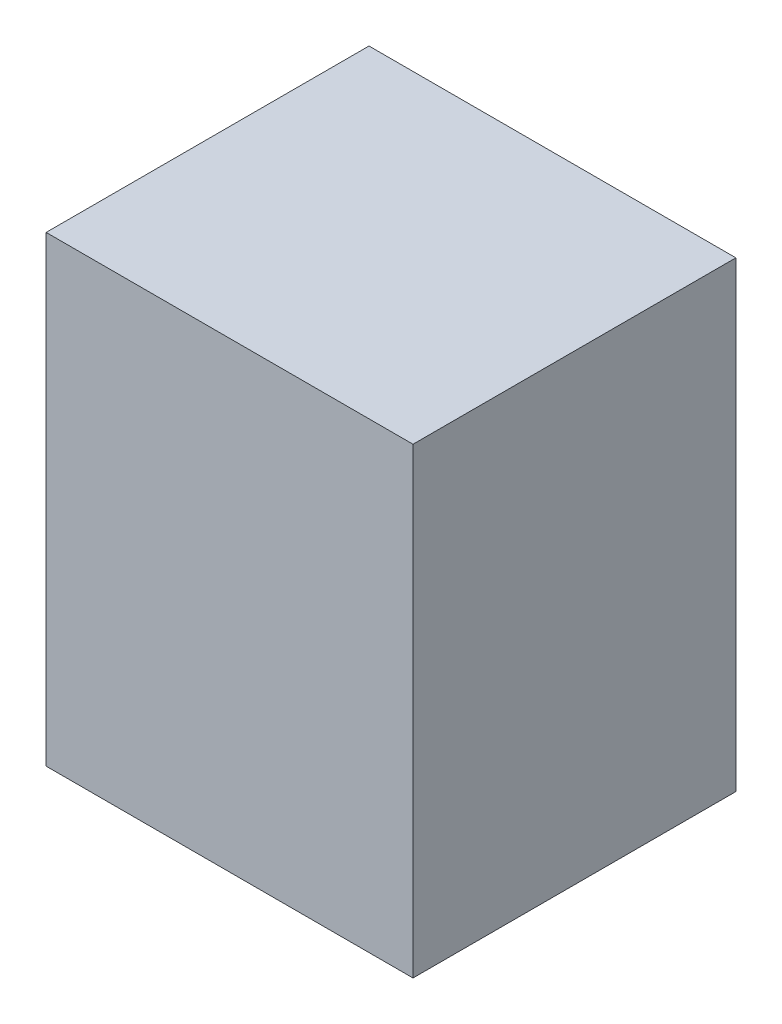
ISO-10303-21;
HEADER;
FILE_DESCRIPTION(('STEP AP214'),'2;1');
FILE_NAME('part.step','',(''),(''),'','','');
FILE_SCHEMA(('AUTOMOTIVE_DESIGN { 1 0 10303 214 1 1 1 1 }'));
ENDSEC;
DATA;
#1=APPLICATION_CONTEXT('core data for automotive mechanical design processes');
#2=APPLICATION_PROTOCOL_DEFINITION('international standard','automotive_design',2000,#1);
#3=PRODUCT_CONTEXT('',#1,'mechanical');
#4=PRODUCT('Part','Part','',(#3));
#5=PRODUCT_RELATED_PRODUCT_CATEGORY('part','',(#4));
#6=PRODUCT_DEFINITION_FORMATION('','',#4);
#7=PRODUCT_DEFINITION_CONTEXT('part definition',#1,'design');
#8=PRODUCT_DEFINITION('design','',#6,#7);
#9=PRODUCT_DEFINITION_SHAPE('','',#8);
#10=(LENGTH_UNIT() NAMED_UNIT(*) SI_UNIT(.MILLI.,.METRE.));
#11=(NAMED_UNIT(*) PLANE_ANGLE_UNIT() SI_UNIT($,.RADIAN.));
#12=(NAMED_UNIT(*) SI_UNIT($,.STERADIAN.) SOLID_ANGLE_UNIT());
#13=UNCERTAINTY_MEASURE_WITH_UNIT(LENGTH_MEASURE(1.E-05),#10,'distance_accuracy_value','');
#14=(GEOMETRIC_REPRESENTATION_CONTEXT(3) GLOBAL_UNCERTAINTY_ASSIGNED_CONTEXT((#13)) GLOBAL_UNIT_ASSIGNED_CONTEXT((#10,
#11,#12)) REPRESENTATION_CONTEXT('',''));
#15=CARTESIAN_POINT('',(0.,0.,0.));
#16=DIRECTION('',(0.,0.,1.));
#17=DIRECTION('',(1.,0.,0.));
#18=AXIS2_PLACEMENT_3D('',#15,#16,#17);
#19=CARTESIAN_POINT('',(0.,160.02,0.));
#20=DIRECTION('',(0.,0.,-1.));
#21=DIRECTION('',(-1.,0.,0.));
#22=AXIS2_PLACEMENT_3D('',#19,#20,#21);
#23=PLANE('',#22);
#24=DIRECTION('',(1.,0.,0.));
#25=VECTOR('',#24,1.);
#26=CARTESIAN_POINT('',(0.,0.,0.));
#27=LINE('',#26,#25);
#28=CARTESIAN_POINT('',(0.,0.,0.));
#29=VERTEX_POINT('',#28);
#30=CARTESIAN_POINT('',(127.,0.,0.));
#31=VERTEX_POINT('',#30);
#32=EDGE_CURVE('E97',#29,#31,#27,.T.);
#33=ORIENTED_EDGE('',*,*,#32,.T.);
#34=DIRECTION('',(0.,-1.,0.));
#35=VECTOR('',#34,1.);
#36=CARTESIAN_POINT('',(127.,160.02,0.));
#37=LINE('',#36,#35);
#38=CARTESIAN_POINT('',(127.,160.02,0.));
#39=VERTEX_POINT('',#38);
#40=EDGE_CURVE('E11',#39,#31,#37,.T.);
#41=ORIENTED_EDGE('',*,*,#40,.F.);
#42=DIRECTION('',(1.,0.,0.));
#43=VECTOR('',#42,1.);
#44=CARTESIAN_POINT('',(0.,160.02,0.));
#45=LINE('',#44,#43);
#46=CARTESIAN_POINT('',(0.,160.02,0.));
#47=VERTEX_POINT('',#46);
#48=EDGE_CURVE('E83',#47,#39,#45,.T.);
#49=ORIENTED_EDGE('',*,*,#48,.F.);
#50=DIRECTION('',(0.,-1.,0.));
#51=VECTOR('',#50,1.);
#52=CARTESIAN_POINT('',(0.,160.02,0.));
#53=LINE('',#52,#51);
#54=EDGE_CURVE('E50',#47,#29,#53,.T.);
#55=ORIENTED_EDGE('',*,*,#54,.T.);
#56=EDGE_LOOP('',(#33,#41,#49,#55));
#57=FACE_BOUND('',#56,.T.);
#58=ADVANCED_FACE('F34',(#57),#23,.F.);
#59=CARTESIAN_POINT('',(127.,160.02,0.));
#60=DIRECTION('',(-1.,0.,0.));
#61=DIRECTION('',(0.,0.,1.));
#62=AXIS2_PLACEMENT_3D('',#59,#60,#61);
#63=PLANE('',#62);
#64=DIRECTION('',(0.,0.,-1.));
#65=VECTOR('',#64,1.);
#66=CARTESIAN_POINT('',(127.,0.,0.));
#67=LINE('',#66,#65);
#68=CARTESIAN_POINT('',(127.,0.,-111.76));
#69=VERTEX_POINT('',#68);
#70=EDGE_CURVE('E88',#31,#69,#67,.T.);
#71=ORIENTED_EDGE('',*,*,#70,.T.);
#72=DIRECTION('',(0.,-1.,0.));
#73=VECTOR('',#72,1.);
#74=CARTESIAN_POINT('',(127.,160.02,-111.76));
#75=LINE('',#74,#73);
#76=CARTESIAN_POINT('',(127.,160.02,-111.76));
#77=VERTEX_POINT('',#76);
#78=EDGE_CURVE('E42',#77,#69,#75,.T.);
#79=ORIENTED_EDGE('',*,*,#78,.F.);
#80=DIRECTION('',(0.,0.,-1.));
#81=VECTOR('',#80,1.);
#82=CARTESIAN_POINT('',(127.,160.02,0.));
#83=LINE('',#82,#81);
#84=EDGE_CURVE('E75',#39,#77,#83,.T.);
#85=ORIENTED_EDGE('',*,*,#84,.F.);
#86=ORIENTED_EDGE('',*,*,#40,.T.);
#87=EDGE_LOOP('',(#71,#79,#85,#86));
#88=FACE_BOUND('',#87,.T.);
#89=ADVANCED_FACE('F87',(#88),#63,.F.);
#90=CARTESIAN_POINT('',(0.,160.02,-111.76));
#91=DIRECTION('',(0.,0.,-1.));
#92=DIRECTION('',(-1.,0.,0.));
#93=AXIS2_PLACEMENT_3D('',#90,#91,#92);
#94=PLANE('',#93);
#95=DIRECTION('',(1.,0.,0.));
#96=VECTOR('',#95,1.);
#97=CARTESIAN_POINT('',(0.,0.,-111.76));
#98=LINE('',#97,#96);
#99=CARTESIAN_POINT('',(0.,0.,-111.76));
#100=VERTEX_POINT('',#99);
#101=EDGE_CURVE('E100',#100,#69,#98,.T.);
#102=ORIENTED_EDGE('',*,*,#101,.F.);
#103=DIRECTION('',(0.,-1.,0.));
#104=VECTOR('',#103,1.);
#105=CARTESIAN_POINT('',(0.,160.02,-111.76));
#106=LINE('',#105,#104);
#107=CARTESIAN_POINT('',(0.,160.02,-111.76));
#108=VERTEX_POINT('',#107);
#109=EDGE_CURVE('E64',#108,#100,#106,.T.);
#110=ORIENTED_EDGE('',*,*,#109,.F.);
#111=DIRECTION('',(1.,0.,0.));
#112=VECTOR('',#111,1.);
#113=CARTESIAN_POINT('',(0.,160.02,-111.76));
#114=LINE('',#113,#112);
#115=EDGE_CURVE('E82',#108,#77,#114,.T.);
#116=ORIENTED_EDGE('',*,*,#115,.T.);
#117=ORIENTED_EDGE('',*,*,#78,.T.);
#118=EDGE_LOOP('',(#102,#110,#116,#117));
#119=FACE_BOUND('',#118,.T.);
#120=ADVANCED_FACE('F91',(#119),#94,.T.);
#121=CARTESIAN_POINT('',(0.,160.02,0.));
#122=DIRECTION('',(-1.,0.,0.));
#123=DIRECTION('',(0.,0.,1.));
#124=AXIS2_PLACEMENT_3D('',#121,#122,#123);
#125=PLANE('',#124);
#126=DIRECTION('',(0.,0.,-1.));
#127=VECTOR('',#126,1.);
#128=CARTESIAN_POINT('',(0.,0.,0.));
#129=LINE('',#128,#127);
#130=EDGE_CURVE('E102',#29,#100,#129,.T.);
#131=ORIENTED_EDGE('',*,*,#130,.F.);
#132=ORIENTED_EDGE('',*,*,#54,.F.);
#133=DIRECTION('',(0.,0.,-1.));
#134=VECTOR('',#133,1.);
#135=CARTESIAN_POINT('',(0.,160.02,0.));
#136=LINE('',#135,#134);
#137=EDGE_CURVE('E92',#47,#108,#136,.T.);
#138=ORIENTED_EDGE('',*,*,#137,.T.);
#139=ORIENTED_EDGE('',*,*,#109,.T.);
#140=EDGE_LOOP('',(#131,#132,#138,#139));
#141=FACE_BOUND('',#140,.T.);
#142=ADVANCED_FACE('F108',(#141),#125,.T.);
#143=CARTESIAN_POINT('',(0.,160.02,0.));
#144=DIRECTION('',(0.,1.,0.));
#145=DIRECTION('',(0.,0.,1.));
#146=AXIS2_PLACEMENT_3D('',#143,#144,#145);
#147=PLANE('',#146);
#148=ORIENTED_EDGE('',*,*,#48,.T.);
#149=ORIENTED_EDGE('',*,*,#84,.T.);
#150=ORIENTED_EDGE('',*,*,#115,.F.);
#151=ORIENTED_EDGE('',*,*,#137,.F.);
#152=EDGE_LOOP('',(#148,#149,#150,#151));
#153=FACE_BOUND('',#152,.T.);
#154=ADVANCED_FACE('F79',(#153),#147,.T.);
#155=CARTESIAN_POINT('',(0.,0.,0.));
#156=DIRECTION('',(0.,1.,0.));
#157=DIRECTION('',(0.,0.,1.));
#158=AXIS2_PLACEMENT_3D('',#155,#156,#157);
#159=PLANE('',#158);
#160=ORIENTED_EDGE('',*,*,#32,.F.);
#161=ORIENTED_EDGE('',*,*,#130,.T.);
#162=ORIENTED_EDGE('',*,*,#101,.T.);
#163=ORIENTED_EDGE('',*,*,#70,.F.);
#164=EDGE_LOOP('',(#160,#161,#162,#163));
#165=FACE_BOUND('',#164,.T.);
#166=ADVANCED_FACE('F107',(#165),#159,.F.);
#167=CLOSED_SHELL('',(#58,#89,#120,#142,#154,#166));
#168=MANIFOLD_SOLID_BREP('B2',#167);
#169=ADVANCED_BREP_SHAPE_REPRESENTATION('',(#18,#168),#14);
#170=SHAPE_DEFINITION_REPRESENTATION(#9,#169);
ENDSEC;
END-ISO-10303-21;
